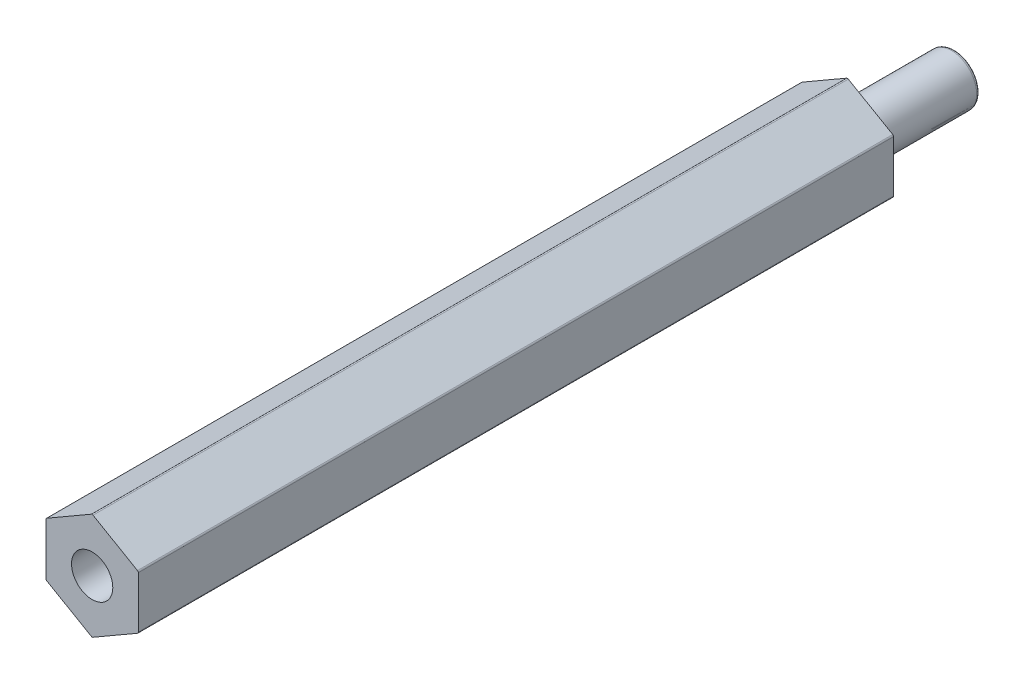
ISO-10303-21;
HEADER;
FILE_DESCRIPTION(('STEP AP214'),'2;1');
FILE_NAME('part.step','',(''),(''),'','','');
FILE_SCHEMA(('AUTOMOTIVE_DESIGN { 1 0 10303 214 1 1 1 1 }'));
ENDSEC;
DATA;
#1=APPLICATION_CONTEXT('core data for automotive mechanical design processes');
#2=APPLICATION_PROTOCOL_DEFINITION('international standard','automotive_design',2000,#1);
#3=PRODUCT_CONTEXT('',#1,'mechanical');
#4=PRODUCT('Part','Part','',(#3));
#5=PRODUCT_RELATED_PRODUCT_CATEGORY('part','',(#4));
#6=PRODUCT_DEFINITION_FORMATION('','',#4);
#7=PRODUCT_DEFINITION_CONTEXT('part definition',#1,'design');
#8=PRODUCT_DEFINITION('design','',#6,#7);
#9=PRODUCT_DEFINITION_SHAPE('','',#8);
#10=(LENGTH_UNIT() NAMED_UNIT(*) SI_UNIT(.MILLI.,.METRE.));
#11=(NAMED_UNIT(*) PLANE_ANGLE_UNIT() SI_UNIT($,.RADIAN.));
#12=(NAMED_UNIT(*) SI_UNIT($,.STERADIAN.) SOLID_ANGLE_UNIT());
#13=UNCERTAINTY_MEASURE_WITH_UNIT(LENGTH_MEASURE(1.E-05),#10,'distance_accuracy_value','');
#14=(GEOMETRIC_REPRESENTATION_CONTEXT(3) GLOBAL_UNCERTAINTY_ASSIGNED_CONTEXT((#13)) GLOBAL_UNIT_ASSIGNED_CONTEXT((#10,
#11,#12)) REPRESENTATION_CONTEXT('',''));
#15=CARTESIAN_POINT('',(0.,0.,0.));
#16=DIRECTION('',(0.,0.,1.));
#17=DIRECTION('',(1.,0.,0.));
#18=AXIS2_PLACEMENT_3D('',#15,#16,#17);
#19=CARTESIAN_POINT('',(0.,0.,-6.2));
#20=DIRECTION('',(0.,0.,-1.));
#21=DIRECTION('',(-1.,0.,0.));
#22=AXIS2_PLACEMENT_3D('',#19,#20,#21);
#23=TOROIDAL_SURFACE('',#22,1.3,0.2);
#24=CARTESIAN_POINT('',(0.,0.,-6.2));
#25=DIRECTION('',(0.,0.,-1.));
#26=DIRECTION('',(1.,0.,0.));
#27=AXIS2_PLACEMENT_3D('',#24,#25,#26);
#28=CIRCLE('',#27,1.5);
#29=CARTESIAN_POINT('',(-1.5,0.,-6.2));
#30=VERTEX_POINT('',#29);
#31=EDGE_CURVE('P0_E11',#30,#30,#28,.T.);
#32=ORIENTED_EDGE('',*,*,#31,.T.);
#33=EDGE_LOOP('',(#32));
#34=FACE_BOUND('',#33,.T.);
#35=CARTESIAN_POINT('',(0.,0.,-6.4));
#36=DIRECTION('',(0.,0.,1.));
#37=DIRECTION('',(1.,0.,0.));
#38=AXIS2_PLACEMENT_3D('',#35,#36,#37);
#39=CIRCLE('',#38,1.3);
#40=CARTESIAN_POINT('',(-1.3,0.,-6.4));
#41=VERTEX_POINT('',#40);
#42=EDGE_CURVE('P0_E51',#41,#41,#39,.T.);
#43=ORIENTED_EDGE('',*,*,#42,.T.);
#44=EDGE_LOOP('',(#43));
#45=FACE_BOUND('',#44,.T.);
#46=ADVANCED_FACE('P0_F41',(#34,#45),#23,.T.);
#47=CARTESIAN_POINT('',(0.,0.,0.));
#48=DIRECTION('',(0.,0.,-1.));
#49=DIRECTION('',(1.,0.,0.));
#50=AXIS2_PLACEMENT_3D('',#47,#48,#49);
#51=CYLINDRICAL_SURFACE('',#50,1.5);
#52=CARTESIAN_POINT('',(0.,0.,0.));
#53=DIRECTION('',(0.,0.,1.));
#54=DIRECTION('',(1.,0.,0.));
#55=AXIS2_PLACEMENT_3D('',#52,#53,#54);
#56=CIRCLE('',#55,1.5);
#57=CARTESIAN_POINT('',(-1.5,0.,0.));
#58=VERTEX_POINT('',#57);
#59=EDGE_CURVE('P0_E175',#58,#58,#56,.T.);
#60=ORIENTED_EDGE('',*,*,#59,.F.);
#61=EDGE_LOOP('',(#60));
#62=FACE_BOUND('',#61,.T.);
#63=ORIENTED_EDGE('',*,*,#31,.F.);
#64=EDGE_LOOP('',(#63));
#65=FACE_BOUND('',#64,.T.);
#66=ADVANCED_FACE('P0_F241',(#62,#65),#51,.T.);
#67=CARTESIAN_POINT('',(0.,0.,-6.4));
#68=DIRECTION('',(0.,0.,1.));
#69=DIRECTION('',(1.,0.,0.));
#70=AXIS2_PLACEMENT_3D('',#67,#68,#69);
#71=PLANE('',#70);
#72=ORIENTED_EDGE('',*,*,#42,.F.);
#73=EDGE_LOOP('',(#72));
#74=FACE_BOUND('',#73,.T.);
#75=ADVANCED_FACE('P0_F238',(#74),#71,.F.);
#76=CARTESIAN_POINT('',(-2.65,-1.53230652808246,0.));
#77=DIRECTION('',(0.,0.,1.));
#78=DIRECTION('',(-0.866181221002111,-0.499730019493819,0.));
#79=AXIS2_PLACEMENT_3D('',#76,#77,#78);
#80=CYLINDRICAL_SURFACE('',#79,0.1);
#81=DIRECTION('',(0.,0.,1.));
#82=VECTOR('',#81,1.);
#83=CARTESIAN_POINT('',(-2.70005398152334,-1.61887787977378,0.));
#84=LINE('',#83,#82);
#85=CARTESIAN_POINT('',(-2.70005398152334,-1.61887787977378,0.));
#86=VERTEX_POINT('',#85);
#87=CARTESIAN_POINT('',(-2.70005398152334,-1.61887787977378,45.));
#88=VERTEX_POINT('',#87);
#89=EDGE_CURVE('P0_E162',#86,#88,#84,.T.);
#90=ORIENTED_EDGE('',*,*,#89,.T.);
#91=CARTESIAN_POINT('',(-2.65,-1.53230652808246,45.));
#92=DIRECTION('',(0.,0.,1.));
#93=DIRECTION('',(1.,0.,0.));
#94=AXIS2_PLACEMENT_3D('',#91,#92,#93);
#95=CIRCLE('',#94,0.100000000000002);
#96=CARTESIAN_POINT('',(-2.75,-1.53230652808246,45.));
#97=VERTEX_POINT('',#96);
#98=EDGE_CURVE('P0_E287',#97,#88,#95,.T.);
#99=ORIENTED_EDGE('',*,*,#98,.F.);
#100=DIRECTION('',(0.,0.,-1.));
#101=VECTOR('',#100,1.);
#102=CARTESIAN_POINT('',(-2.75,-1.53230652808246,0.));
#103=LINE('',#102,#101);
#104=CARTESIAN_POINT('',(-2.75,-1.53230652808246,0.));
#105=VERTEX_POINT('',#104);
#106=EDGE_CURVE('P0_E102',#97,#105,#103,.T.);
#107=ORIENTED_EDGE('',*,*,#106,.T.);
#108=CARTESIAN_POINT('',(-2.65,-1.53230652808246,0.));
#109=DIRECTION('',(0.,0.,1.));
#110=DIRECTION('',(-0.866181221002111,-0.499730019493819,0.));
#111=AXIS2_PLACEMENT_3D('',#108,#109,#110);
#112=CIRCLE('',#111,0.1);
#113=EDGE_CURVE('P0_E223',#105,#86,#112,.T.);
#114=ORIENTED_EDGE('',*,*,#113,.T.);
#115=EDGE_LOOP('',(#90,#99,#107,#114));
#116=FACE_BOUND('',#115,.T.);
#117=ADVANCED_FACE('P0_F240',(#116),#80,.T.);
#118=CARTESIAN_POINT('',(-2.75,1.59,0.));
#119=DIRECTION('',(-1.,0.,0.));
#120=DIRECTION('',(0.,0.,1.));
#121=AXIS2_PLACEMENT_3D('',#118,#119,#120);
#122=PLANE('',#121);
#123=ORIENTED_EDGE('',*,*,#106,.F.);
#124=DIRECTION('',(0.,-1.,0.));
#125=VECTOR('',#124,1.);
#126=CARTESIAN_POINT('',(-2.75,1.53230652808246,45.));
#127=LINE('',#126,#125);
#128=CARTESIAN_POINT('',(-2.75,1.53230652808246,45.));
#129=VERTEX_POINT('',#128);
#130=EDGE_CURVE('P0_E177',#129,#97,#127,.T.);
#131=ORIENTED_EDGE('',*,*,#130,.F.);
#132=DIRECTION('',(0.,0.,1.));
#133=VECTOR('',#132,1.);
#134=CARTESIAN_POINT('',(-2.75,1.53230652808246,0.));
#135=LINE('',#134,#133);
#136=CARTESIAN_POINT('',(-2.75,1.53230652808246,0.));
#137=VERTEX_POINT('',#136);
#138=EDGE_CURVE('P0_E167',#137,#129,#135,.T.);
#139=ORIENTED_EDGE('',*,*,#138,.F.);
#140=DIRECTION('',(0.,1.,0.));
#141=VECTOR('',#140,1.);
#142=CARTESIAN_POINT('',(-2.75,-1.59,0.));
#143=LINE('',#142,#141);
#144=EDGE_CURVE('P0_E220',#105,#137,#143,.T.);
#145=ORIENTED_EDGE('',*,*,#144,.F.);
#146=EDGE_LOOP('',(#123,#131,#139,#145));
#147=FACE_BOUND('',#146,.T.);
#148=ADVANCED_FACE('P0_F247',(#147),#122,.T.);
#149=CARTESIAN_POINT('',(0.,-3.06448834626428,0.));
#150=DIRECTION('',(0.,0.,1.));
#151=DIRECTION('',(0.,-1.,0.));
#152=AXIS2_PLACEMENT_3D('',#149,#150,#151);
#153=CYLINDRICAL_SURFACE('',#152,0.1);
#154=DIRECTION('',(0.,0.,1.));
#155=VECTOR('',#154,1.);
#156=CARTESIAN_POINT('',(0.0500539815233412,-3.15105969795559,0.));
#157=LINE('',#156,#155);
#158=CARTESIAN_POINT('',(0.0500539815233414,-3.15105969795559,0.));
#159=VERTEX_POINT('',#158);
#160=CARTESIAN_POINT('',(0.0500539815233435,-3.15105969795559,45.));
#161=VERTEX_POINT('',#160);
#162=EDGE_CURVE('P0_E157',#159,#161,#157,.T.);
#163=ORIENTED_EDGE('',*,*,#162,.T.);
#164=CARTESIAN_POINT('',(0.,-3.06448834626428,45.));
#165=DIRECTION('',(0.,0.,1.));
#166=DIRECTION('',(1.,0.,0.));
#167=AXIS2_PLACEMENT_3D('',#164,#165,#166);
#168=CIRCLE('',#167,0.100000000000004);
#169=CARTESIAN_POINT('',(-0.0500539815233399,-3.1510596979556,45.));
#170=VERTEX_POINT('',#169);
#171=EDGE_CURVE('P0_E294',#170,#161,#168,.T.);
#172=ORIENTED_EDGE('',*,*,#171,.F.);
#173=DIRECTION('',(0.,0.,-1.));
#174=VECTOR('',#173,1.);
#175=CARTESIAN_POINT('',(-0.0500539815233408,-3.15105969795559,0.));
#176=LINE('',#175,#174);
#177=CARTESIAN_POINT('',(-0.050053981523341,-3.1510596979556,0.));
#178=VERTEX_POINT('',#177);
#179=EDGE_CURVE('P0_E159',#170,#178,#176,.T.);
#180=ORIENTED_EDGE('',*,*,#179,.T.);
#181=CARTESIAN_POINT('',(0.,-3.06448834626428,0.));
#182=DIRECTION('',(0.,0.,1.));
#183=DIRECTION('',(0.,-1.,0.));
#184=AXIS2_PLACEMENT_3D('',#181,#182,#183);
#185=CIRCLE('',#184,0.1);
#186=EDGE_CURVE('P0_E163',#178,#159,#185,.T.);
#187=ORIENTED_EDGE('',*,*,#186,.T.);
#188=EDGE_LOOP('',(#163,#172,#180,#187));
#189=FACE_BOUND('',#188,.T.);
#190=ADVANCED_FACE('P0_F320',(#189),#153,.T.);
#191=CARTESIAN_POINT('',(0.,-3.18,0.));
#192=DIRECTION('',(0.50053981523341,-0.865713516913132,0.));
#193=DIRECTION('',(0.,0.,-1.));
#194=AXIS2_PLACEMENT_3D('',#191,#192,#193);
#195=PLANE('',#194);
#196=ORIENTED_EDGE('',*,*,#162,.F.);
#197=DIRECTION('',(-0.865713516913132,-0.50053981523341,0.));
#198=VECTOR('',#197,1.);
#199=CARTESIAN_POINT('',(2.75,-1.59,0.));
#200=LINE('',#199,#198);
#201=CARTESIAN_POINT('',(2.70005398152334,-1.61887787977378,0.));
#202=VERTEX_POINT('',#201);
#203=EDGE_CURVE('P0_E45',#202,#159,#200,.T.);
#204=ORIENTED_EDGE('',*,*,#203,.F.);
#205=DIRECTION('',(0.,0.,-1.));
#206=VECTOR('',#205,1.);
#207=CARTESIAN_POINT('',(2.70005398152334,-1.61887787977378,0.));
#208=LINE('',#207,#206);
#209=CARTESIAN_POINT('',(2.70005398152334,-1.61887787977378,45.));
#210=VERTEX_POINT('',#209);
#211=EDGE_CURVE('P0_E140',#210,#202,#208,.T.);
#212=ORIENTED_EDGE('',*,*,#211,.F.);
#213=DIRECTION('',(0.865713516913132,0.50053981523341,0.));
#214=VECTOR('',#213,1.);
#215=CARTESIAN_POINT('',(0.0500539815233435,-3.15105969795559,45.));
#216=LINE('',#215,#214);
#217=EDGE_CURVE('P0_E301',#161,#210,#216,.T.);
#218=ORIENTED_EDGE('',*,*,#217,.F.);
#219=EDGE_LOOP('',(#196,#204,#212,#218));
#220=FACE_BOUND('',#219,.T.);
#221=ADVANCED_FACE('P0_F321',(#220),#195,.T.);
#222=CARTESIAN_POINT('',(2.65,-1.53230652808246,0.));
#223=DIRECTION('',(0.,0.,1.));
#224=DIRECTION('',(0.866181221002107,-0.499730019493825,0.));
#225=AXIS2_PLACEMENT_3D('',#222,#223,#224);
#226=CYLINDRICAL_SURFACE('',#225,0.1);
#227=DIRECTION('',(0.,0.,1.));
#228=VECTOR('',#227,1.);
#229=CARTESIAN_POINT('',(2.75,-1.53230652808246,0.));
#230=LINE('',#229,#228);
#231=CARTESIAN_POINT('',(2.75,-1.53230652808246,0.));
#232=VERTEX_POINT('',#231);
#233=CARTESIAN_POINT('',(2.75,-1.53230652808246,45.));
#234=VERTEX_POINT('',#233);
#235=EDGE_CURVE('P0_E121',#232,#234,#230,.T.);
#236=ORIENTED_EDGE('',*,*,#235,.T.);
#237=CARTESIAN_POINT('',(2.65,-1.53230652808246,45.));
#238=DIRECTION('',(0.,0.,1.));
#239=DIRECTION('',(1.,0.,0.));
#240=AXIS2_PLACEMENT_3D('',#237,#238,#239);
#241=CIRCLE('',#240,0.100000000000004);
#242=EDGE_CURVE('P0_E304',#210,#234,#241,.T.);
#243=ORIENTED_EDGE('',*,*,#242,.F.);
#244=ORIENTED_EDGE('',*,*,#211,.T.);
#245=CARTESIAN_POINT('',(2.65,-1.53230652808246,0.));
#246=DIRECTION('',(0.,0.,1.));
#247=DIRECTION('',(0.866181221002107,-0.499730019493825,0.));
#248=AXIS2_PLACEMENT_3D('',#245,#246,#247);
#249=CIRCLE('',#248,0.1);
#250=EDGE_CURVE('P0_E133',#202,#232,#249,.T.);
#251=ORIENTED_EDGE('',*,*,#250,.T.);
#252=EDGE_LOOP('',(#236,#243,#244,#251));
#253=FACE_BOUND('',#252,.T.);
#254=ADVANCED_FACE('P0_F138',(#253),#226,.T.);
#255=CARTESIAN_POINT('',(-2.65,1.53230652808246,0.));
#256=DIRECTION('',(0.,0.,1.));
#257=DIRECTION('',(-0.866181221002109,0.499730019493822,0.));
#258=AXIS2_PLACEMENT_3D('',#255,#256,#257);
#259=CYLINDRICAL_SURFACE('',#258,0.1);
#260=ORIENTED_EDGE('',*,*,#138,.T.);
#261=CARTESIAN_POINT('',(-2.65,1.53230652808246,45.));
#262=DIRECTION('',(0.,0.,1.));
#263=DIRECTION('',(1.,0.,0.));
#264=AXIS2_PLACEMENT_3D('',#261,#262,#263);
#265=CIRCLE('',#264,0.100000000000004);
#266=CARTESIAN_POINT('',(-2.70005398152334,1.61887787977378,45.));
#267=VERTEX_POINT('',#266);
#268=EDGE_CURVE('P0_E210',#267,#129,#265,.T.);
#269=ORIENTED_EDGE('',*,*,#268,.F.);
#270=DIRECTION('',(0.,0.,-1.));
#271=VECTOR('',#270,1.);
#272=CARTESIAN_POINT('',(-2.70005398152334,1.61887787977378,0.));
#273=LINE('',#272,#271);
#274=CARTESIAN_POINT('',(-2.70005398152334,1.61887787977378,0.));
#275=VERTEX_POINT('',#274);
#276=EDGE_CURVE('P0_E134',#267,#275,#273,.T.);
#277=ORIENTED_EDGE('',*,*,#276,.T.);
#278=CARTESIAN_POINT('',(-2.65,1.53230652808246,0.));
#279=DIRECTION('',(0.,0.,1.));
#280=DIRECTION('',(-0.866181221002109,0.499730019493822,0.));
#281=AXIS2_PLACEMENT_3D('',#278,#279,#280);
#282=CIRCLE('',#281,0.1);
#283=EDGE_CURVE('P0_E169',#275,#137,#282,.T.);
#284=ORIENTED_EDGE('',*,*,#283,.T.);
#285=EDGE_LOOP('',(#260,#269,#277,#284));
#286=FACE_BOUND('',#285,.T.);
#287=ADVANCED_FACE('P0_F261',(#286),#259,.T.);
#288=CARTESIAN_POINT('',(0.,3.18,0.));
#289=DIRECTION('',(-0.500539815233411,0.865713516913132,0.));
#290=DIRECTION('',(0.,0.,1.));
#291=AXIS2_PLACEMENT_3D('',#288,#289,#290);
#292=PLANE('',#291);
#293=ORIENTED_EDGE('',*,*,#276,.F.);
#294=DIRECTION('',(-0.865713516913133,-0.500539815233409,0.));
#295=VECTOR('',#294,1.);
#296=CARTESIAN_POINT('',(-0.0500539815233419,3.15105969795559,45.));
#297=LINE('',#296,#295);
#298=CARTESIAN_POINT('',(-0.0500539815233419,3.15105969795559,45.));
#299=VERTEX_POINT('',#298);
#300=EDGE_CURVE('P0_E204',#299,#267,#297,.T.);
#301=ORIENTED_EDGE('',*,*,#300,.F.);
#302=DIRECTION('',(0.,0.,1.));
#303=VECTOR('',#302,1.);
#304=CARTESIAN_POINT('',(-0.0500539815233414,3.15105969795559,0.));
#305=LINE('',#304,#303);
#306=CARTESIAN_POINT('',(-0.050053981523342,3.15105969795559,0.));
#307=VERTEX_POINT('',#306);
#308=EDGE_CURVE('P0_E166',#307,#299,#305,.T.);
#309=ORIENTED_EDGE('',*,*,#308,.F.);
#310=DIRECTION('',(0.865713516913132,0.500539815233411,0.));
#311=VECTOR('',#310,1.);
#312=CARTESIAN_POINT('',(-2.75,1.59,0.));
#313=LINE('',#312,#311);
#314=EDGE_CURVE('P0_E150',#275,#307,#313,.T.);
#315=ORIENTED_EDGE('',*,*,#314,.F.);
#316=EDGE_LOOP('',(#293,#301,#309,#315));
#317=FACE_BOUND('',#316,.T.);
#318=ADVANCED_FACE('P0_F282',(#317),#292,.T.);
#319=CARTESIAN_POINT('',(2.65,1.53230652808246,0.));
#320=DIRECTION('',(0.,0.,1.));
#321=DIRECTION('',(0.866181221002109,0.499730019493822,0.));
#322=AXIS2_PLACEMENT_3D('',#319,#320,#321);
#323=CYLINDRICAL_SURFACE('',#322,0.1);
#324=DIRECTION('',(0.,0.,1.));
#325=VECTOR('',#324,1.);
#326=CARTESIAN_POINT('',(2.70005398152334,1.61887787977378,0.));
#327=LINE('',#326,#325);
#328=CARTESIAN_POINT('',(2.70005398152334,1.61887787977378,0.));
#329=VERTEX_POINT('',#328);
#330=CARTESIAN_POINT('',(2.70005398152334,1.61887787977378,45.));
#331=VERTEX_POINT('',#330);
#332=EDGE_CURVE('P0_E171',#329,#331,#327,.T.);
#333=ORIENTED_EDGE('',*,*,#332,.T.);
#334=CARTESIAN_POINT('',(2.65,1.53230652808246,45.));
#335=DIRECTION('',(0.,0.,1.));
#336=DIRECTION('',(1.,0.,0.));
#337=AXIS2_PLACEMENT_3D('',#334,#335,#336);
#338=CIRCLE('',#337,0.100000000000001);
#339=CARTESIAN_POINT('',(2.75,1.53230652808246,45.));
#340=VERTEX_POINT('',#339);
#341=EDGE_CURVE('P0_E185',#340,#331,#338,.T.);
#342=ORIENTED_EDGE('',*,*,#341,.F.);
#343=DIRECTION('',(0.,0.,-1.));
#344=VECTOR('',#343,1.);
#345=CARTESIAN_POINT('',(2.75,1.53230652808246,0.));
#346=LINE('',#345,#344);
#347=CARTESIAN_POINT('',(2.75,1.53230652808246,0.));
#348=VERTEX_POINT('',#347);
#349=EDGE_CURVE('P0_E155',#340,#348,#346,.T.);
#350=ORIENTED_EDGE('',*,*,#349,.T.);
#351=CARTESIAN_POINT('',(2.65,1.53230652808246,0.));
#352=DIRECTION('',(0.,0.,1.));
#353=DIRECTION('',(0.866181221002109,0.499730019493822,0.));
#354=AXIS2_PLACEMENT_3D('',#351,#352,#353);
#355=CIRCLE('',#354,0.1);
#356=EDGE_CURVE('P0_E146',#348,#329,#355,.T.);
#357=ORIENTED_EDGE('',*,*,#356,.T.);
#358=EDGE_LOOP('',(#333,#342,#350,#357));
#359=FACE_BOUND('',#358,.T.);
#360=ADVANCED_FACE('P0_F183',(#359),#323,.T.);
#361=CARTESIAN_POINT('',(2.75,-1.59,0.));
#362=DIRECTION('',(1.,0.,0.));
#363=DIRECTION('',(0.,1.,0.));
#364=AXIS2_PLACEMENT_3D('',#361,#362,#363);
#365=PLANE('',#364);
#366=ORIENTED_EDGE('',*,*,#235,.F.);
#367=DIRECTION('',(0.,-1.,0.));
#368=VECTOR('',#367,1.);
#369=CARTESIAN_POINT('',(2.75,1.59,0.));
#370=LINE('',#369,#368);
#371=EDGE_CURVE('P0_E126',#348,#232,#370,.T.);
#372=ORIENTED_EDGE('',*,*,#371,.F.);
#373=ORIENTED_EDGE('',*,*,#349,.F.);
#374=DIRECTION('',(0.,1.,0.));
#375=VECTOR('',#374,1.);
#376=CARTESIAN_POINT('',(2.75,-1.53230652808246,45.));
#377=LINE('',#376,#375);
#378=EDGE_CURVE('P0_E129',#234,#340,#377,.T.);
#379=ORIENTED_EDGE('',*,*,#378,.F.);
#380=EDGE_LOOP('',(#366,#372,#373,#379));
#381=FACE_BOUND('',#380,.T.);
#382=ADVANCED_FACE('P0_F123',(#381),#365,.T.);
#383=CARTESIAN_POINT('',(0.,3.06448834626428,0.));
#384=DIRECTION('',(0.,0.,1.));
#385=DIRECTION('',(0.,1.,0.));
#386=AXIS2_PLACEMENT_3D('',#383,#384,#385);
#387=CYLINDRICAL_SURFACE('',#386,0.1);
#388=ORIENTED_EDGE('',*,*,#308,.T.);
#389=CARTESIAN_POINT('',(0.,3.06448834626428,45.));
#390=DIRECTION('',(0.,0.,1.));
#391=DIRECTION('',(1.,0.,0.));
#392=AXIS2_PLACEMENT_3D('',#389,#390,#391);
#393=CIRCLE('',#392,0.0999999999999977);
#394=CARTESIAN_POINT('',(0.0500539815233409,3.15105969795559,45.));
#395=VERTEX_POINT('',#394);
#396=EDGE_CURVE('P0_E202',#395,#299,#393,.T.);
#397=ORIENTED_EDGE('',*,*,#396,.F.);
#398=DIRECTION('',(0.,0.,-1.));
#399=VECTOR('',#398,1.);
#400=CARTESIAN_POINT('',(0.050053981523341,3.1510596979556,0.));
#401=LINE('',#400,#399);
#402=CARTESIAN_POINT('',(0.0500539815233408,3.15105969795559,0.));
#403=VERTEX_POINT('',#402);
#404=EDGE_CURVE('P0_E165',#395,#403,#401,.T.);
#405=ORIENTED_EDGE('',*,*,#404,.T.);
#406=CARTESIAN_POINT('',(0.,3.06448834626428,0.));
#407=DIRECTION('',(0.,0.,1.));
#408=DIRECTION('',(0.,1.,0.));
#409=AXIS2_PLACEMENT_3D('',#406,#407,#408);
#410=CIRCLE('',#409,0.1);
#411=EDGE_CURVE('P0_E90',#403,#307,#410,.T.);
#412=ORIENTED_EDGE('',*,*,#411,.T.);
#413=EDGE_LOOP('',(#388,#397,#405,#412));
#414=FACE_BOUND('',#413,.T.);
#415=ADVANCED_FACE('P0_F43',(#414),#387,.T.);
#416=CARTESIAN_POINT('',(2.75,1.59,0.));
#417=DIRECTION('',(0.500539815233411,0.865713516913132,0.));
#418=DIRECTION('',(0.,0.,-1.));
#419=AXIS2_PLACEMENT_3D('',#416,#417,#418);
#420=PLANE('',#419);
#421=ORIENTED_EDGE('',*,*,#332,.F.);
#422=DIRECTION('',(0.865713516913132,-0.500539815233411,0.));
#423=VECTOR('',#422,1.);
#424=CARTESIAN_POINT('',(0.,3.18,0.));
#425=LINE('',#424,#423);
#426=EDGE_CURVE('P0_E148',#403,#329,#425,.T.);
#427=ORIENTED_EDGE('',*,*,#426,.F.);
#428=ORIENTED_EDGE('',*,*,#404,.F.);
#429=DIRECTION('',(-0.865713516913132,0.50053981523341,0.));
#430=VECTOR('',#429,1.);
#431=CARTESIAN_POINT('',(2.70005398152334,1.61887787977378,45.));
#432=LINE('',#431,#430);
#433=EDGE_CURVE('P0_E197',#331,#395,#432,.T.);
#434=ORIENTED_EDGE('',*,*,#433,.F.);
#435=EDGE_LOOP('',(#421,#427,#428,#434));
#436=FACE_BOUND('',#435,.T.);
#437=ADVANCED_FACE('P0_F201',(#436),#420,.T.);
#438=CARTESIAN_POINT('',(-2.75,-1.59,0.));
#439=DIRECTION('',(-0.50053981523341,-0.865713516913132,0.));
#440=DIRECTION('',(-0.865713516913132,0.50053981523341,0.));
#441=AXIS2_PLACEMENT_3D('',#438,#439,#440);
#442=PLANE('',#441);
#443=ORIENTED_EDGE('',*,*,#89,.F.);
#444=DIRECTION('',(-0.865713516913132,0.50053981523341,0.));
#445=VECTOR('',#444,1.);
#446=CARTESIAN_POINT('',(0.,-3.18,0.));
#447=LINE('',#446,#445);
#448=EDGE_CURVE('P0_E152',#178,#86,#447,.T.);
#449=ORIENTED_EDGE('',*,*,#448,.F.);
#450=ORIENTED_EDGE('',*,*,#179,.F.);
#451=DIRECTION('',(0.865713516913131,-0.500539815233412,0.));
#452=VECTOR('',#451,1.);
#453=CARTESIAN_POINT('',(-2.70005398152334,-1.61887787977378,45.));
#454=LINE('',#453,#452);
#455=EDGE_CURVE('P0_E291',#88,#170,#454,.T.);
#456=ORIENTED_EDGE('',*,*,#455,.F.);
#457=EDGE_LOOP('',(#443,#449,#450,#456));
#458=FACE_BOUND('',#457,.T.);
#459=ADVANCED_FACE('P0_F264',(#458),#442,.T.);
#460=CARTESIAN_POINT('',(0.,0.,0.));
#461=DIRECTION('',(0.,0.,1.));
#462=DIRECTION('',(1.,0.,0.));
#463=AXIS2_PLACEMENT_3D('',#460,#461,#462);
#464=PLANE('',#463);
#465=ORIENTED_EDGE('',*,*,#113,.F.);
#466=ORIENTED_EDGE('',*,*,#144,.T.);
#467=ORIENTED_EDGE('',*,*,#283,.F.);
#468=ORIENTED_EDGE('',*,*,#314,.T.);
#469=ORIENTED_EDGE('',*,*,#411,.F.);
#470=ORIENTED_EDGE('',*,*,#426,.T.);
#471=ORIENTED_EDGE('',*,*,#356,.F.);
#472=ORIENTED_EDGE('',*,*,#371,.T.);
#473=ORIENTED_EDGE('',*,*,#250,.F.);
#474=ORIENTED_EDGE('',*,*,#203,.T.);
#475=ORIENTED_EDGE('',*,*,#186,.F.);
#476=ORIENTED_EDGE('',*,*,#448,.T.);
#477=EDGE_LOOP('',(#465,#466,#467,#468,#469,#470,#471,#472,#473,#474,#475,#476));
#478=FACE_BOUND('',#477,.T.);
#479=ORIENTED_EDGE('',*,*,#59,.T.);
#480=EDGE_LOOP('',(#479));
#481=FACE_BOUND('',#480,.T.);
#482=ADVANCED_FACE('P0_F143',(#478,#481),#464,.F.);
#483=CARTESIAN_POINT('',(-2.65,-1.53230652808246,45.));
#484=DIRECTION('',(0.,0.,1.));
#485=DIRECTION('',(1.,0.,0.));
#486=AXIS2_PLACEMENT_3D('',#483,#484,#485);
#487=PLANE('',#486);
#488=ORIENTED_EDGE('',*,*,#98,.T.);
#489=ORIENTED_EDGE('',*,*,#455,.T.);
#490=ORIENTED_EDGE('',*,*,#171,.T.);
#491=ORIENTED_EDGE('',*,*,#217,.T.);
#492=ORIENTED_EDGE('',*,*,#242,.T.);
#493=ORIENTED_EDGE('',*,*,#378,.T.);
#494=ORIENTED_EDGE('',*,*,#341,.T.);
#495=ORIENTED_EDGE('',*,*,#433,.T.);
#496=ORIENTED_EDGE('',*,*,#396,.T.);
#497=ORIENTED_EDGE('',*,*,#300,.T.);
#498=ORIENTED_EDGE('',*,*,#268,.T.);
#499=ORIENTED_EDGE('',*,*,#130,.T.);
#500=EDGE_LOOP('',(#488,#489,#490,#491,#492,#493,#494,#495,#496,#497,#498,#499));
#501=FACE_BOUND('',#500,.T.);
#502=CARTESIAN_POINT('',(0.,0.,45.));
#503=DIRECTION('',(0.,0.,1.));
#504=DIRECTION('',(1.,0.,0.));
#505=AXIS2_PLACEMENT_3D('',#502,#503,#504);
#506=CIRCLE('',#505,1.2295);
#507=CARTESIAN_POINT('',(1.2295,0.,45.));
#508=VERTEX_POINT('',#507);
#509=EDGE_CURVE('P0_E292',#508,#508,#506,.T.);
#510=ORIENTED_EDGE('',*,*,#509,.F.);
#511=EDGE_LOOP('',(#510));
#512=FACE_BOUND('',#511,.T.);
#513=ADVANCED_FACE('P0_F194',(#501,#512),#487,.T.);
#514=CARTESIAN_POINT('',(0.,0.,0.));
#515=DIRECTION('',(0.,0.,1.));
#516=DIRECTION('',(1.,0.,0.));
#517=AXIS2_PLACEMENT_3D('',#514,#515,#516);
#518=PLANE('',#517);
#519=CARTESIAN_POINT('',(0.,0.,0.));
#520=DIRECTION('',(0.,0.,1.));
#521=DIRECTION('',(1.,0.,0.));
#522=AXIS2_PLACEMENT_3D('',#519,#520,#521);
#523=CIRCLE('',#522,1.2295);
#524=CARTESIAN_POINT('',(-1.2295,0.,0.));
#525=VERTEX_POINT('',#524);
#526=EDGE_CURVE('P0_E214',#525,#525,#523,.T.);
#527=ORIENTED_EDGE('',*,*,#526,.T.);
#528=EDGE_LOOP('',(#527));
#529=FACE_BOUND('',#528,.T.);
#530=ADVANCED_FACE('P0_F341',(#529),#518,.T.);
#531=CARTESIAN_POINT('',(0.,0.,1.6));
#532=DIRECTION('',(0.,0.,1.));
#533=DIRECTION('',(1.,0.,0.));
#534=AXIS2_PLACEMENT_3D('',#531,#532,#533);
#535=CYLINDRICAL_SURFACE('',#534,1.2295);
#536=ORIENTED_EDGE('',*,*,#526,.F.);
#537=EDGE_LOOP('',(#536));
#538=FACE_BOUND('',#537,.T.);
#539=ORIENTED_EDGE('',*,*,#509,.T.);
#540=EDGE_LOOP('',(#539));
#541=FACE_BOUND('',#540,.T.);
#542=ADVANCED_FACE('P0_F339',(#538,#541),#535,.F.);
#543=CLOSED_SHELL('',(#46,#66,#75,#117,#148,#190,#221,#254,#287,#318,#360,#382,#415,#437,#459,
#482,#513,#530,#542));
#544=MANIFOLD_SOLID_BREP('P0_B2',#543);
#545=CARTESIAN_POINT('',(0.,0.,-6.2));
#546=DIRECTION('',(0.,0.,-1.));
#547=DIRECTION('',(-1.,0.,0.));
#548=AXIS2_PLACEMENT_3D('',#545,#546,#547);
#549=TOROIDAL_SURFACE('',#548,1.3,0.2);
#550=CARTESIAN_POINT('',(0.,0.,-6.2));
#551=DIRECTION('',(0.,0.,-1.));
#552=DIRECTION('',(1.,0.,0.));
#553=AXIS2_PLACEMENT_3D('',#550,#551,#552);
#554=CIRCLE('',#553,1.5);
#555=CARTESIAN_POINT('',(-1.5,0.,-6.2));
#556=VERTEX_POINT('',#555);
#557=EDGE_CURVE('P1_E11',#556,#556,#554,.T.);
#558=ORIENTED_EDGE('',*,*,#557,.T.);
#559=EDGE_LOOP('',(#558));
#560=FACE_BOUND('',#559,.T.);
#561=CARTESIAN_POINT('',(0.,0.,-6.4));
#562=DIRECTION('',(0.,0.,1.));
#563=DIRECTION('',(1.,0.,0.));
#564=AXIS2_PLACEMENT_3D('',#561,#562,#563);
#565=CIRCLE('',#564,1.3);
#566=CARTESIAN_POINT('',(-1.3,0.,-6.4));
#567=VERTEX_POINT('',#566);
#568=EDGE_CURVE('P1_E27',#567,#567,#565,.T.);
#569=ORIENTED_EDGE('',*,*,#568,.T.);
#570=EDGE_LOOP('',(#569));
#571=FACE_BOUND('',#570,.T.);
#572=ADVANCED_FACE('P1_F16',(#560,#571),#549,.T.);
#573=CARTESIAN_POINT('',(0.,0.,0.));
#574=DIRECTION('',(0.,0.,-1.));
#575=DIRECTION('',(1.,0.,0.));
#576=AXIS2_PLACEMENT_3D('',#573,#574,#575);
#577=CYLINDRICAL_SURFACE('',#576,1.5);
#578=CARTESIAN_POINT('',(0.,0.,0.));
#579=DIRECTION('',(0.,0.,1.));
#580=DIRECTION('',(1.,0.,0.));
#581=AXIS2_PLACEMENT_3D('',#578,#579,#580);
#582=CIRCLE('',#581,1.5);
#583=CARTESIAN_POINT('',(-1.5,0.,0.));
#584=VERTEX_POINT('',#583);
#585=EDGE_CURVE('P1_E209',#584,#584,#582,.T.);
#586=ORIENTED_EDGE('',*,*,#585,.F.);
#587=EDGE_LOOP('',(#586));
#588=FACE_BOUND('',#587,.T.);
#589=ORIENTED_EDGE('',*,*,#557,.F.);
#590=EDGE_LOOP('',(#589));
#591=FACE_BOUND('',#590,.T.);
#592=ADVANCED_FACE('P1_F320',(#588,#591),#577,.T.);
#593=CARTESIAN_POINT('',(0.,0.,-6.4));
#594=DIRECTION('',(0.,0.,1.));
#595=DIRECTION('',(1.,0.,0.));
#596=AXIS2_PLACEMENT_3D('',#593,#594,#595);
#597=PLANE('',#596);
#598=ORIENTED_EDGE('',*,*,#568,.F.);
#599=EDGE_LOOP('',(#598));
#600=FACE_BOUND('',#599,.T.);
#601=ADVANCED_FACE('P1_F339',(#600),#597,.F.);
#602=CARTESIAN_POINT('',(0.,0.,0.));
#603=DIRECTION('',(0.,0.,1.));
#604=DIRECTION('',(1.,0.,0.));
#605=AXIS2_PLACEMENT_3D('',#602,#603,#604);
#606=PLANE('',#605);
#607=CARTESIAN_POINT('',(0.,0.,0.));
#608=DIRECTION('',(0.,0.,1.));
#609=DIRECTION('',(1.,0.,0.));
#610=AXIS2_PLACEMENT_3D('',#607,#608,#609);
#611=CIRCLE('',#610,1.2295);
#612=CARTESIAN_POINT('',(-1.2295,0.,0.));
#613=VERTEX_POINT('',#612);
#614=EDGE_CURVE('P1_E183',#613,#613,#611,.T.);
#615=ORIENTED_EDGE('',*,*,#614,.T.);
#616=EDGE_LOOP('',(#615));
#617=FACE_BOUND('',#616,.T.);
#618=ADVANCED_FACE('P1_F367',(#617),#606,.T.);
#619=CARTESIAN_POINT('',(-2.65,-1.53230652808246,0.));
#620=DIRECTION('',(0.,0.,1.));
#621=DIRECTION('',(-0.866181221002111,-0.499730019493819,0.));
#622=AXIS2_PLACEMENT_3D('',#619,#620,#621);
#623=CYLINDRICAL_SURFACE('',#622,0.1);
#624=CARTESIAN_POINT('',(-2.65,-1.53230652808246,6.));
#625=DIRECTION('',(0.,0.,-1.));
#626=DIRECTION('',(-0.866181221002111,-0.499730019493819,0.));
#627=AXIS2_PLACEMENT_3D('',#624,#625,#626);
#628=CIRCLE('',#627,0.1);
#629=CARTESIAN_POINT('',(-2.70005398152334,-1.61887787977378,6.));
#630=VERTEX_POINT('',#629);
#631=CARTESIAN_POINT('',(-2.75,-1.53230652808246,6.));
#632=VERTEX_POINT('',#631);
#633=EDGE_CURVE('P1_E213',#630,#632,#628,.T.);
#634=ORIENTED_EDGE('',*,*,#633,.T.);
#635=DIRECTION('',(0.,0.,-1.));
#636=VECTOR('',#635,1.);
#637=CARTESIAN_POINT('',(-2.75,-1.53230652808246,0.));
#638=LINE('',#637,#636);
#639=CARTESIAN_POINT('',(-2.75,-1.53230652808246,0.));
#640=VERTEX_POINT('',#639);
#641=EDGE_CURVE('P1_E203',#632,#640,#638,.T.);
#642=ORIENTED_EDGE('',*,*,#641,.T.);
#643=CARTESIAN_POINT('',(-2.65,-1.53230652808246,0.));
#644=DIRECTION('',(0.,0.,1.));
#645=DIRECTION('',(-0.866181221002111,-0.499730019493819,0.));
#646=AXIS2_PLACEMENT_3D('',#643,#644,#645);
#647=CIRCLE('',#646,0.1);
#648=CARTESIAN_POINT('',(-2.70005398152334,-1.61887787977378,0.));
#649=VERTEX_POINT('',#648);
#650=EDGE_CURVE('P1_E199',#640,#649,#647,.T.);
#651=ORIENTED_EDGE('',*,*,#650,.T.);
#652=DIRECTION('',(0.,0.,1.));
#653=VECTOR('',#652,1.);
#654=CARTESIAN_POINT('',(-2.70005398152334,-1.61887787977378,0.));
#655=LINE('',#654,#653);
#656=EDGE_CURVE('P1_E204',#649,#630,#655,.T.);
#657=ORIENTED_EDGE('',*,*,#656,.T.);
#658=EDGE_LOOP('',(#634,#642,#651,#657));
#659=FACE_BOUND('',#658,.T.);
#660=ADVANCED_FACE('P1_F364',(#659),#623,.T.);
#661=CARTESIAN_POINT('',(-2.75,1.59,0.));
#662=DIRECTION('',(-1.,0.,0.));
#663=DIRECTION('',(0.,0.,1.));
#664=AXIS2_PLACEMENT_3D('',#661,#662,#663);
#665=PLANE('',#664);
#666=ORIENTED_EDGE('',*,*,#641,.F.);
#667=DIRECTION('',(0.,-1.,0.));
#668=VECTOR('',#667,1.);
#669=CARTESIAN_POINT('',(-2.75,-1.59,6.));
#670=LINE('',#669,#668);
#671=CARTESIAN_POINT('',(-2.75,1.53230652808246,6.));
#672=VERTEX_POINT('',#671);
#673=EDGE_CURVE('P1_E146',#672,#632,#670,.T.);
#674=ORIENTED_EDGE('',*,*,#673,.F.);
#675=DIRECTION('',(0.,0.,1.));
#676=VECTOR('',#675,1.);
#677=CARTESIAN_POINT('',(-2.75,1.53230652808246,0.));
#678=LINE('',#677,#676);
#679=CARTESIAN_POINT('',(-2.75,1.53230652808246,0.));
#680=VERTEX_POINT('',#679);
#681=EDGE_CURVE('P1_E198',#680,#672,#678,.T.);
#682=ORIENTED_EDGE('',*,*,#681,.F.);
#683=DIRECTION('',(0.,1.,0.));
#684=VECTOR('',#683,1.);
#685=CARTESIAN_POINT('',(-2.75,-1.59,0.));
#686=LINE('',#685,#684);
#687=EDGE_CURVE('P1_E193',#640,#680,#686,.T.);
#688=ORIENTED_EDGE('',*,*,#687,.F.);
#689=EDGE_LOOP('',(#666,#674,#682,#688));
#690=FACE_BOUND('',#689,.T.);
#691=ADVANCED_FACE('P1_F351',(#690),#665,.T.);
#692=CARTESIAN_POINT('',(0.,0.,6.));
#693=DIRECTION('',(0.,0.,1.));
#694=DIRECTION('',(1.,0.,0.));
#695=AXIS2_PLACEMENT_3D('',#692,#693,#694);
#696=PLANE('',#695);
#697=ORIENTED_EDGE('',*,*,#633,.F.);
#698=DIRECTION('',(0.865713516913132,-0.50053981523341,0.));
#699=VECTOR('',#698,1.);
#700=CARTESIAN_POINT('',(0.,-3.18,6.));
#701=LINE('',#700,#699);
#702=CARTESIAN_POINT('',(-0.050053981523341,-3.1510596979556,6.));
#703=VERTEX_POINT('',#702);
#704=EDGE_CURVE('P1_E232',#630,#703,#701,.T.);
#705=ORIENTED_EDGE('',*,*,#704,.T.);
#706=CARTESIAN_POINT('',(0.,-3.06448834626428,6.));
#707=DIRECTION('',(0.,0.,-1.));
#708=DIRECTION('',(0.,-1.,0.));
#709=AXIS2_PLACEMENT_3D('',#706,#707,#708);
#710=CIRCLE('',#709,0.1);
#711=CARTESIAN_POINT('',(0.0500539815233414,-3.15105969795559,6.));
#712=VERTEX_POINT('',#711);
#713=EDGE_CURVE('P1_E147',#712,#703,#710,.T.);
#714=ORIENTED_EDGE('',*,*,#713,.F.);
#715=DIRECTION('',(0.865713516913132,0.50053981523341,0.));
#716=VECTOR('',#715,1.);
#717=CARTESIAN_POINT('',(2.75,-1.59,6.));
#718=LINE('',#717,#716);
#719=CARTESIAN_POINT('',(2.70005398152334,-1.61887787977378,6.));
#720=VERTEX_POINT('',#719);
#721=EDGE_CURVE('P1_E249',#712,#720,#718,.T.);
#722=ORIENTED_EDGE('',*,*,#721,.T.);
#723=CARTESIAN_POINT('',(2.65,-1.53230652808246,6.));
#724=DIRECTION('',(0.,0.,-1.));
#725=DIRECTION('',(0.866181221002107,-0.499730019493825,0.));
#726=AXIS2_PLACEMENT_3D('',#723,#724,#725);
#727=CIRCLE('',#726,0.1);
#728=CARTESIAN_POINT('',(2.75,-1.53230652808246,6.));
#729=VERTEX_POINT('',#728);
#730=EDGE_CURVE('P1_E160',#729,#720,#727,.T.);
#731=ORIENTED_EDGE('',*,*,#730,.F.);
#732=DIRECTION('',(0.,1.,0.));
#733=VECTOR('',#732,1.);
#734=CARTESIAN_POINT('',(2.75,1.59,6.));
#735=LINE('',#734,#733);
#736=CARTESIAN_POINT('',(2.75,1.53230652808246,6.));
#737=VERTEX_POINT('',#736);
#738=EDGE_CURVE('P1_E245',#729,#737,#735,.T.);
#739=ORIENTED_EDGE('',*,*,#738,.T.);
#740=CARTESIAN_POINT('',(2.65,1.53230652808246,6.));
#741=DIRECTION('',(0.,0.,-1.));
#742=DIRECTION('',(0.866181221002109,0.499730019493822,0.));
#743=AXIS2_PLACEMENT_3D('',#740,#741,#742);
#744=CIRCLE('',#743,0.1);
#745=CARTESIAN_POINT('',(2.70005398152334,1.61887787977378,6.));
#746=VERTEX_POINT('',#745);
#747=EDGE_CURVE('P1_E210',#746,#737,#744,.T.);
#748=ORIENTED_EDGE('',*,*,#747,.F.);
#749=DIRECTION('',(-0.865713516913132,0.500539815233411,0.));
#750=VECTOR('',#749,1.);
#751=CARTESIAN_POINT('',(0.,3.18,6.));
#752=LINE('',#751,#750);
#753=CARTESIAN_POINT('',(0.0500539815233408,3.15105969795559,6.));
#754=VERTEX_POINT('',#753);
#755=EDGE_CURVE('P1_E250',#746,#754,#752,.T.);
#756=ORIENTED_EDGE('',*,*,#755,.T.);
#757=CARTESIAN_POINT('',(0.,3.06448834626428,6.));
#758=DIRECTION('',(0.,0.,-1.));
#759=DIRECTION('',(0.,1.,0.));
#760=AXIS2_PLACEMENT_3D('',#757,#758,#759);
#761=CIRCLE('',#760,0.1);
#762=CARTESIAN_POINT('',(-0.050053981523342,3.15105969795559,6.));
#763=VERTEX_POINT('',#762);
#764=EDGE_CURVE('P1_E163',#763,#754,#761,.T.);
#765=ORIENTED_EDGE('',*,*,#764,.F.);
#766=DIRECTION('',(-0.865713516913132,-0.500539815233411,0.));
#767=VECTOR('',#766,1.);
#768=CARTESIAN_POINT('',(-2.75,1.59,6.));
#769=LINE('',#768,#767);
#770=CARTESIAN_POINT('',(-2.70005398152334,1.61887787977378,6.));
#771=VERTEX_POINT('',#770);
#772=EDGE_CURVE('P1_E155',#763,#771,#769,.T.);
#773=ORIENTED_EDGE('',*,*,#772,.T.);
#774=CARTESIAN_POINT('',(-2.65,1.53230652808246,6.));
#775=DIRECTION('',(0.,0.,-1.));
#776=DIRECTION('',(-0.866181221002109,0.499730019493822,0.));
#777=AXIS2_PLACEMENT_3D('',#774,#775,#776);
#778=CIRCLE('',#777,0.1);
#779=EDGE_CURVE('P1_E188',#672,#771,#778,.T.);
#780=ORIENTED_EDGE('',*,*,#779,.F.);
#781=ORIENTED_EDGE('',*,*,#673,.T.);
#782=EDGE_LOOP('',(#697,#705,#714,#722,#731,#739,#748,#756,#765,#773,#780,#781));
#783=FACE_BOUND('',#782,.T.);
#784=CARTESIAN_POINT('',(0.,0.,6.));
#785=DIRECTION('',(0.,0.,-1.));
#786=DIRECTION('',(1.,0.,0.));
#787=AXIS2_PLACEMENT_3D('',#784,#785,#786);
#788=CIRCLE('',#787,1.2295);
#789=CARTESIAN_POINT('',(1.2295,0.,6.));
#790=VERTEX_POINT('',#789);
#791=EDGE_CURVE('P1_E142',#790,#790,#788,.T.);
#792=ORIENTED_EDGE('',*,*,#791,.T.);
#793=EDGE_LOOP('',(#792));
#794=FACE_BOUND('',#793,.T.);
#795=ADVANCED_FACE('P1_F301',(#783,#794),#696,.T.);
#796=CARTESIAN_POINT('',(0.,-3.06448834626428,0.));
#797=DIRECTION('',(0.,0.,1.));
#798=DIRECTION('',(0.,-1.,0.));
#799=AXIS2_PLACEMENT_3D('',#796,#797,#798);
#800=CYLINDRICAL_SURFACE('',#799,0.1);
#801=ORIENTED_EDGE('',*,*,#713,.T.);
#802=DIRECTION('',(0.,0.,-1.));
#803=VECTOR('',#802,1.);
#804=CARTESIAN_POINT('',(-0.0500539815233408,-3.15105969795559,0.));
#805=LINE('',#804,#803);
#806=CARTESIAN_POINT('',(-0.050053981523341,-3.1510596979556,0.));
#807=VERTEX_POINT('',#806);
#808=EDGE_CURVE('P1_E157',#703,#807,#805,.T.);
#809=ORIENTED_EDGE('',*,*,#808,.T.);
#810=CARTESIAN_POINT('',(0.,-3.06448834626428,0.));
#811=DIRECTION('',(0.,0.,1.));
#812=DIRECTION('',(0.,-1.,0.));
#813=AXIS2_PLACEMENT_3D('',#810,#811,#812);
#814=CIRCLE('',#813,0.1);
#815=CARTESIAN_POINT('',(0.0500539815233414,-3.15105969795559,0.));
#816=VERTEX_POINT('',#815);
#817=EDGE_CURVE('P1_E224',#807,#816,#814,.T.);
#818=ORIENTED_EDGE('',*,*,#817,.T.);
#819=DIRECTION('',(0.,0.,1.));
#820=VECTOR('',#819,1.);
#821=CARTESIAN_POINT('',(0.0500539815233412,-3.15105969795559,0.));
#822=LINE('',#821,#820);
#823=EDGE_CURVE('P1_E228',#816,#712,#822,.T.);
#824=ORIENTED_EDGE('',*,*,#823,.T.);
#825=EDGE_LOOP('',(#801,#809,#818,#824));
#826=FACE_BOUND('',#825,.T.);
#827=ADVANCED_FACE('P1_F350',(#826),#800,.T.);
#828=CARTESIAN_POINT('',(0.,-3.18,0.));
#829=DIRECTION('',(0.50053981523341,-0.865713516913132,0.));
#830=DIRECTION('',(0.,0.,-1.));
#831=AXIS2_PLACEMENT_3D('',#828,#829,#830);
#832=PLANE('',#831);
#833=ORIENTED_EDGE('',*,*,#823,.F.);
#834=DIRECTION('',(-0.865713516913132,-0.50053981523341,0.));
#835=VECTOR('',#834,1.);
#836=CARTESIAN_POINT('',(2.75,-1.59,0.));
#837=LINE('',#836,#835);
#838=CARTESIAN_POINT('',(2.70005398152334,-1.61887787977378,0.));
#839=VERTEX_POINT('',#838);
#840=EDGE_CURVE('P1_E20',#839,#816,#837,.T.);
#841=ORIENTED_EDGE('',*,*,#840,.F.);
#842=DIRECTION('',(0.,0.,-1.));
#843=VECTOR('',#842,1.);
#844=CARTESIAN_POINT('',(2.70005398152334,-1.61887787977378,0.));
#845=LINE('',#844,#843);
#846=EDGE_CURVE('P1_E251',#720,#839,#845,.T.);
#847=ORIENTED_EDGE('',*,*,#846,.F.);
#848=ORIENTED_EDGE('',*,*,#721,.F.);
#849=EDGE_LOOP('',(#833,#841,#847,#848));
#850=FACE_BOUND('',#849,.T.);
#851=ADVANCED_FACE('P1_F375',(#850),#832,.T.);
#852=CARTESIAN_POINT('',(2.65,-1.53230652808246,0.));
#853=DIRECTION('',(0.,0.,1.));
#854=DIRECTION('',(0.866181221002107,-0.499730019493825,0.));
#855=AXIS2_PLACEMENT_3D('',#852,#853,#854);
#856=CYLINDRICAL_SURFACE('',#855,0.1);
#857=ORIENTED_EDGE('',*,*,#730,.T.);
#858=ORIENTED_EDGE('',*,*,#846,.T.);
#859=CARTESIAN_POINT('',(2.65,-1.53230652808246,0.));
#860=DIRECTION('',(0.,0.,1.));
#861=DIRECTION('',(0.866181221002107,-0.499730019493825,0.));
#862=AXIS2_PLACEMENT_3D('',#859,#860,#861);
#863=CIRCLE('',#862,0.1);
#864=CARTESIAN_POINT('',(2.75,-1.53230652808246,0.));
#865=VERTEX_POINT('',#864);
#866=EDGE_CURVE('P1_E255',#839,#865,#863,.T.);
#867=ORIENTED_EDGE('',*,*,#866,.T.);
#868=DIRECTION('',(0.,0.,1.));
#869=VECTOR('',#868,1.);
#870=CARTESIAN_POINT('',(2.75,-1.53230652808246,0.));
#871=LINE('',#870,#869);
#872=EDGE_CURVE('P1_E256',#865,#729,#871,.T.);
#873=ORIENTED_EDGE('',*,*,#872,.T.);
#874=EDGE_LOOP('',(#857,#858,#867,#873));
#875=FACE_BOUND('',#874,.T.);
#876=ADVANCED_FACE('P1_F288',(#875),#856,.T.);
#877=CARTESIAN_POINT('',(-2.65,1.53230652808246,0.));
#878=DIRECTION('',(0.,0.,1.));
#879=DIRECTION('',(-0.866181221002109,0.499730019493822,0.));
#880=AXIS2_PLACEMENT_3D('',#877,#878,#879);
#881=CYLINDRICAL_SURFACE('',#880,0.1);
#882=ORIENTED_EDGE('',*,*,#779,.T.);
#883=DIRECTION('',(0.,0.,-1.));
#884=VECTOR('',#883,1.);
#885=CARTESIAN_POINT('',(-2.70005398152334,1.61887787977378,0.));
#886=LINE('',#885,#884);
#887=CARTESIAN_POINT('',(-2.70005398152334,1.61887787977378,0.));
#888=VERTEX_POINT('',#887);
#889=EDGE_CURVE('P1_E184',#771,#888,#886,.T.);
#890=ORIENTED_EDGE('',*,*,#889,.T.);
#891=CARTESIAN_POINT('',(-2.65,1.53230652808246,0.));
#892=DIRECTION('',(0.,0.,1.));
#893=DIRECTION('',(-0.866181221002109,0.499730019493822,0.));
#894=AXIS2_PLACEMENT_3D('',#891,#892,#893);
#895=CIRCLE('',#894,0.1);
#896=EDGE_CURVE('P1_E189',#888,#680,#895,.T.);
#897=ORIENTED_EDGE('',*,*,#896,.T.);
#898=ORIENTED_EDGE('',*,*,#681,.T.);
#899=EDGE_LOOP('',(#882,#890,#897,#898));
#900=FACE_BOUND('',#899,.T.);
#901=ADVANCED_FACE('P1_F344',(#900),#881,.T.);
#902=CARTESIAN_POINT('',(0.,3.18,0.));
#903=DIRECTION('',(-0.500539815233411,0.865713516913132,0.));
#904=DIRECTION('',(0.,0.,1.));
#905=AXIS2_PLACEMENT_3D('',#902,#903,#904);
#906=PLANE('',#905);
#907=ORIENTED_EDGE('',*,*,#889,.F.);
#908=ORIENTED_EDGE('',*,*,#772,.F.);
#909=DIRECTION('',(0.,0.,1.));
#910=VECTOR('',#909,1.);
#911=CARTESIAN_POINT('',(-0.0500539815233414,3.15105969795559,0.));
#912=LINE('',#911,#910);
#913=CARTESIAN_POINT('',(-0.050053981523342,3.15105969795559,0.));
#914=VERTEX_POINT('',#913);
#915=EDGE_CURVE('P1_E220',#914,#763,#912,.T.);
#916=ORIENTED_EDGE('',*,*,#915,.F.);
#917=DIRECTION('',(0.865713516913132,0.500539815233411,0.));
#918=VECTOR('',#917,1.);
#919=CARTESIAN_POINT('',(-2.75,1.59,0.));
#920=LINE('',#919,#918);
#921=EDGE_CURVE('P1_E190',#888,#914,#920,.T.);
#922=ORIENTED_EDGE('',*,*,#921,.F.);
#923=EDGE_LOOP('',(#907,#908,#916,#922));
#924=FACE_BOUND('',#923,.T.);
#925=ADVANCED_FACE('P1_F369',(#924),#906,.T.);
#926=CARTESIAN_POINT('',(2.65,1.53230652808246,0.));
#927=DIRECTION('',(0.,0.,1.));
#928=DIRECTION('',(0.866181221002109,0.499730019493822,0.));
#929=AXIS2_PLACEMENT_3D('',#926,#927,#928);
#930=CYLINDRICAL_SURFACE('',#929,0.1);
#931=ORIENTED_EDGE('',*,*,#747,.T.);
#932=DIRECTION('',(0.,0.,-1.));
#933=VECTOR('',#932,1.);
#934=CARTESIAN_POINT('',(2.75,1.53230652808246,0.));
#935=LINE('',#934,#933);
#936=CARTESIAN_POINT('',(2.75,1.53230652808246,0.));
#937=VERTEX_POINT('',#936);
#938=EDGE_CURVE('P1_E170',#737,#937,#935,.T.);
#939=ORIENTED_EDGE('',*,*,#938,.T.);
#940=CARTESIAN_POINT('',(2.65,1.53230652808246,0.));
#941=DIRECTION('',(0.,0.,1.));
#942=DIRECTION('',(0.866181221002109,0.499730019493822,0.));
#943=AXIS2_PLACEMENT_3D('',#940,#941,#942);
#944=CIRCLE('',#943,0.1);
#945=CARTESIAN_POINT('',(2.70005398152334,1.61887787977378,0.));
#946=VERTEX_POINT('',#945);
#947=EDGE_CURVE('P1_E162',#937,#946,#944,.T.);
#948=ORIENTED_EDGE('',*,*,#947,.T.);
#949=DIRECTION('',(0.,0.,1.));
#950=VECTOR('',#949,1.);
#951=CARTESIAN_POINT('',(2.70005398152334,1.61887787977378,0.));
#952=LINE('',#951,#950);
#953=EDGE_CURVE('P1_E125',#946,#746,#952,.T.);
#954=ORIENTED_EDGE('',*,*,#953,.T.);
#955=EDGE_LOOP('',(#931,#939,#948,#954));
#956=FACE_BOUND('',#955,.T.);
#957=ADVANCED_FACE('P1_F348',(#956),#930,.T.);
#958=CARTESIAN_POINT('',(2.75,-1.59,0.));
#959=DIRECTION('',(1.,0.,0.));
#960=DIRECTION('',(0.,1.,0.));
#961=AXIS2_PLACEMENT_3D('',#958,#959,#960);
#962=PLANE('',#961);
#963=ORIENTED_EDGE('',*,*,#872,.F.);
#964=DIRECTION('',(0.,-1.,0.));
#965=VECTOR('',#964,1.);
#966=CARTESIAN_POINT('',(2.75,1.59,0.));
#967=LINE('',#966,#965);
#968=EDGE_CURVE('P1_E241',#937,#865,#967,.T.);
#969=ORIENTED_EDGE('',*,*,#968,.F.);
#970=ORIENTED_EDGE('',*,*,#938,.F.);
#971=ORIENTED_EDGE('',*,*,#738,.F.);
#972=EDGE_LOOP('',(#963,#969,#970,#971));
#973=FACE_BOUND('',#972,.T.);
#974=ADVANCED_FACE('P1_F296',(#973),#962,.T.);
#975=CARTESIAN_POINT('',(0.,3.06448834626428,0.));
#976=DIRECTION('',(0.,0.,1.));
#977=DIRECTION('',(0.,1.,0.));
#978=AXIS2_PLACEMENT_3D('',#975,#976,#977);
#979=CYLINDRICAL_SURFACE('',#978,0.1);
#980=ORIENTED_EDGE('',*,*,#764,.T.);
#981=DIRECTION('',(0.,0.,-1.));
#982=VECTOR('',#981,1.);
#983=CARTESIAN_POINT('',(0.050053981523341,3.1510596979556,0.));
#984=LINE('',#983,#982);
#985=CARTESIAN_POINT('',(0.0500539815233408,3.15105969795559,0.));
#986=VERTEX_POINT('',#985);
#987=EDGE_CURVE('P1_E172',#754,#986,#984,.T.);
#988=ORIENTED_EDGE('',*,*,#987,.T.);
#989=CARTESIAN_POINT('',(0.,3.06448834626428,0.));
#990=DIRECTION('',(0.,0.,1.));
#991=DIRECTION('',(0.,1.,0.));
#992=AXIS2_PLACEMENT_3D('',#989,#990,#991);
#993=CIRCLE('',#992,0.1);
#994=EDGE_CURVE('P1_E112',#986,#914,#993,.T.);
#995=ORIENTED_EDGE('',*,*,#994,.T.);
#996=ORIENTED_EDGE('',*,*,#915,.T.);
#997=EDGE_LOOP('',(#980,#988,#995,#996));
#998=FACE_BOUND('',#997,.T.);
#999=ADVANCED_FACE('P1_F18',(#998),#979,.T.);
#1000=CARTESIAN_POINT('',(0.,0.,1.6));
#1001=DIRECTION('',(0.,0.,1.));
#1002=DIRECTION('',(1.,0.,0.));
#1003=AXIS2_PLACEMENT_3D('',#1000,#1001,#1002);
#1004=CYLINDRICAL_SURFACE('',#1003,1.2295);
#1005=ORIENTED_EDGE('',*,*,#614,.F.);
#1006=EDGE_LOOP('',(#1005));
#1007=FACE_BOUND('',#1006,.T.);
#1008=ORIENTED_EDGE('',*,*,#791,.F.);
#1009=EDGE_LOOP('',(#1008));
#1010=FACE_BOUND('',#1009,.T.);
#1011=ADVANCED_FACE('P1_F143',(#1007,#1010),#1004,.F.);
#1012=CARTESIAN_POINT('',(2.75,1.59,0.));
#1013=DIRECTION('',(0.500539815233411,0.865713516913132,0.));
#1014=DIRECTION('',(0.,0.,-1.));
#1015=AXIS2_PLACEMENT_3D('',#1012,#1013,#1014);
#1016=PLANE('',#1015);
#1017=ORIENTED_EDGE('',*,*,#953,.F.);
#1018=DIRECTION('',(0.865713516913132,-0.500539815233411,0.));
#1019=VECTOR('',#1018,1.);
#1020=CARTESIAN_POINT('',(0.,3.18,0.));
#1021=LINE('',#1020,#1019);
#1022=EDGE_CURVE('P1_E194',#986,#946,#1021,.T.);
#1023=ORIENTED_EDGE('',*,*,#1022,.F.);
#1024=ORIENTED_EDGE('',*,*,#987,.F.);
#1025=ORIENTED_EDGE('',*,*,#755,.F.);
#1026=EDGE_LOOP('',(#1017,#1023,#1024,#1025));
#1027=FACE_BOUND('',#1026,.T.);
#1028=ADVANCED_FACE('P1_F328',(#1027),#1016,.T.);
#1029=CARTESIAN_POINT('',(-2.75,-1.59,0.));
#1030=DIRECTION('',(-0.50053981523341,-0.865713516913132,0.));
#1031=DIRECTION('',(-0.865713516913132,0.50053981523341,0.));
#1032=AXIS2_PLACEMENT_3D('',#1029,#1030,#1031);
#1033=PLANE('',#1032);
#1034=ORIENTED_EDGE('',*,*,#656,.F.);
#1035=DIRECTION('',(-0.865713516913132,0.50053981523341,0.));
#1036=VECTOR('',#1035,1.);
#1037=CARTESIAN_POINT('',(0.,-3.18,0.));
#1038=LINE('',#1037,#1036);
#1039=EDGE_CURVE('P1_E205',#807,#649,#1038,.T.);
#1040=ORIENTED_EDGE('',*,*,#1039,.F.);
#1041=ORIENTED_EDGE('',*,*,#808,.F.);
#1042=ORIENTED_EDGE('',*,*,#704,.F.);
#1043=EDGE_LOOP('',(#1034,#1040,#1041,#1042));
#1044=FACE_BOUND('',#1043,.T.);
#1045=ADVANCED_FACE('P1_F322',(#1044),#1033,.T.);
#1046=CARTESIAN_POINT('',(0.,0.,0.));
#1047=DIRECTION('',(0.,0.,1.));
#1048=DIRECTION('',(1.,0.,0.));
#1049=AXIS2_PLACEMENT_3D('',#1046,#1047,#1048);
#1050=PLANE('',#1049);
#1051=ORIENTED_EDGE('',*,*,#650,.F.);
#1052=ORIENTED_EDGE('',*,*,#687,.T.);
#1053=ORIENTED_EDGE('',*,*,#896,.F.);
#1054=ORIENTED_EDGE('',*,*,#921,.T.);
#1055=ORIENTED_EDGE('',*,*,#994,.F.);
#1056=ORIENTED_EDGE('',*,*,#1022,.T.);
#1057=ORIENTED_EDGE('',*,*,#947,.F.);
#1058=ORIENTED_EDGE('',*,*,#968,.T.);
#1059=ORIENTED_EDGE('',*,*,#866,.F.);
#1060=ORIENTED_EDGE('',*,*,#840,.T.);
#1061=ORIENTED_EDGE('',*,*,#817,.F.);
#1062=ORIENTED_EDGE('',*,*,#1039,.T.);
#1063=EDGE_LOOP('',(#1051,#1052,#1053,#1054,#1055,#1056,#1057,#1058,#1059,#1060,#1061,#1062));
#1064=FACE_BOUND('',#1063,.T.);
#1065=ORIENTED_EDGE('',*,*,#585,.T.);
#1066=EDGE_LOOP('',(#1065));
#1067=FACE_BOUND('',#1066,.T.);
#1068=ADVANCED_FACE('P1_F292',(#1064,#1067),#1050,.F.);
#1069=CLOSED_SHELL('',(#572,#592,#601,#618,#660,#691,#795,#827,#851,#876,#901,#925,#957,#974,
#999,#1011,#1028,#1045,#1068));
#1070=MANIFOLD_SOLID_BREP('P1_B1',#1069);
#1071=ADVANCED_BREP_SHAPE_REPRESENTATION('',(#18,#544,#1070),#14);
#1072=SHAPE_DEFINITION_REPRESENTATION(#9,#1071);
ENDSEC;
END-ISO-10303-21;
